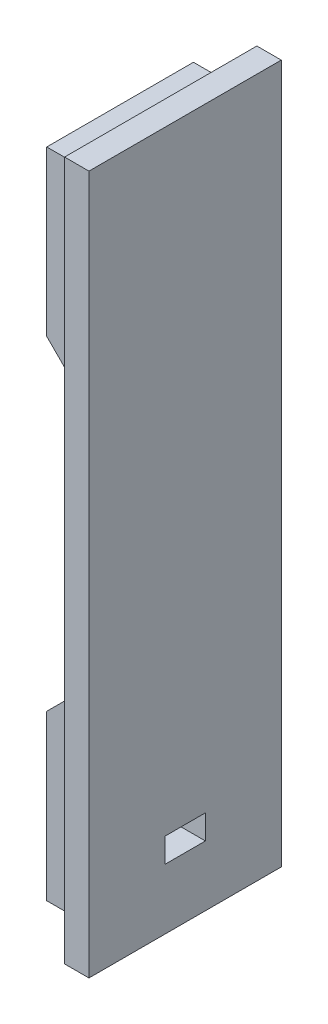
ISO-10303-21;
HEADER;
FILE_DESCRIPTION(('STEP AP214'),'2;1');
FILE_NAME('part.step','',(''),(''),'','','');
FILE_SCHEMA(('AUTOMOTIVE_DESIGN { 1 0 10303 214 1 1 1 1 }'));
ENDSEC;
DATA;
#1=APPLICATION_CONTEXT('core data for automotive mechanical design processes');
#2=APPLICATION_PROTOCOL_DEFINITION('international standard','automotive_design',2000,#1);
#3=PRODUCT_CONTEXT('',#1,'mechanical');
#4=PRODUCT('Part','Part','',(#3));
#5=PRODUCT_RELATED_PRODUCT_CATEGORY('part','',(#4));
#6=PRODUCT_DEFINITION_FORMATION('','',#4);
#7=PRODUCT_DEFINITION_CONTEXT('part definition',#1,'design');
#8=PRODUCT_DEFINITION('design','',#6,#7);
#9=PRODUCT_DEFINITION_SHAPE('','',#8);
#10=(LENGTH_UNIT() NAMED_UNIT(*) SI_UNIT(.MILLI.,.METRE.));
#11=(NAMED_UNIT(*) PLANE_ANGLE_UNIT() SI_UNIT($,.RADIAN.));
#12=(NAMED_UNIT(*) SI_UNIT($,.STERADIAN.) SOLID_ANGLE_UNIT());
#13=UNCERTAINTY_MEASURE_WITH_UNIT(LENGTH_MEASURE(1.E-05),#10,'distance_accuracy_value','');
#14=(GEOMETRIC_REPRESENTATION_CONTEXT(3) GLOBAL_UNCERTAINTY_ASSIGNED_CONTEXT((#13)) GLOBAL_UNIT_ASSIGNED_CONTEXT((#10,
#11,#12)) REPRESENTATION_CONTEXT('',''));
#15=CARTESIAN_POINT('',(0.,0.,0.));
#16=DIRECTION('',(0.,0.,1.));
#17=DIRECTION('',(1.,0.,0.));
#18=AXIS2_PLACEMENT_3D('',#15,#16,#17);
#19=CARTESIAN_POINT('',(-1.81121984232219,-0.482424220250856,-1.));
#20=DIRECTION('',(0.,0.,1.));
#21=DIRECTION('',(1.,0.,0.));
#22=AXIS2_PLACEMENT_3D('',#19,#20,#21);
#23=CYLINDRICAL_SURFACE('',#22,2.5314573644934);
#24=CARTESIAN_POINT('',(-1.81121984232219,-0.482424220250856,-1.));
#25=DIRECTION('',(0.,0.,-1.));
#26=DIRECTION('',(-1.,0.,0.));
#27=AXIS2_PLACEMENT_3D('',#24,#25,#26);
#28=CIRCLE('',#27,2.5314573644934);
#29=CARTESIAN_POINT('',(0.,-2.25097138417559,-1.));
#30=VERTEX_POINT('',#29);
#31=CARTESIAN_POINT('',(-4.03853856337355,-1.68547355552435,-1.));
#32=VERTEX_POINT('',#31);
#33=EDGE_CURVE('E330',#30,#32,#28,.T.);
#34=ORIENTED_EDGE('',*,*,#33,.T.);
#35=DIRECTION('',(0.,0.,-1.));
#36=VECTOR('',#35,1.);
#37=CARTESIAN_POINT('',(-4.03853856337355,-1.68547355552435,1.));
#38=LINE('',#37,#36);
#39=CARTESIAN_POINT('',(-4.03853856337355,-1.68547355552435,1.));
#40=VERTEX_POINT('',#39);
#41=EDGE_CURVE('E549',#40,#32,#38,.T.);
#42=ORIENTED_EDGE('',*,*,#41,.F.);
#43=CARTESIAN_POINT('',(-1.81121984232219,-0.482424220250856,1.));
#44=DIRECTION('',(0.,0.,-1.));
#45=DIRECTION('',(-1.,0.,0.));
#46=AXIS2_PLACEMENT_3D('',#43,#44,#45);
#47=CIRCLE('',#46,2.5314573644934);
#48=CARTESIAN_POINT('',(0.,-2.25097138417559,1.));
#49=VERTEX_POINT('',#48);
#50=EDGE_CURVE('E331',#49,#40,#47,.T.);
#51=ORIENTED_EDGE('',*,*,#50,.F.);
#52=DIRECTION('',(0.,0.,1.));
#53=VECTOR('',#52,1.);
#54=CARTESIAN_POINT('',(0.,-2.25097138417559,-1.));
#55=LINE('',#54,#53);
#56=EDGE_CURVE('E527',#30,#49,#55,.T.);
#57=ORIENTED_EDGE('',*,*,#56,.F.);
#58=EDGE_LOOP('',(#34,#42,#51,#57));
#59=FACE_BOUND('',#58,.T.);
#60=ADVANCED_FACE('F73',(#59),#23,.F.);
#61=CARTESIAN_POINT('',(-1.72556533612713,-0.222878793185611,-1.));
#62=DIRECTION('',(0.,0.,-1.));
#63=DIRECTION('',(-1.,0.,0.));
#64=AXIS2_PLACEMENT_3D('',#61,#62,#63);
#65=PLANE('',#64);
#66=CARTESIAN_POINT('',(-1.72556533612713,-0.222878793185611,-1.));
#67=DIRECTION('',(0.,0.,1.));
#68=DIRECTION('',(-1.,0.,0.));
#69=AXIS2_PLACEMENT_3D('',#66,#67,#68);
#70=CIRCLE('',#69,4.50000000000001);
#71=CARTESIAN_POINT('',(-5.04790859843512,-3.25801227417071,-1.));
#72=VERTEX_POINT('',#71);
#73=CARTESIAN_POINT('',(-0.193000000200739,-4.45386490650682,-1.));
#74=VERTEX_POINT('',#73);
#75=EDGE_CURVE('E327',#72,#74,#70,.T.);
#76=ORIENTED_EDGE('',*,*,#75,.F.);
#77=DIRECTION('',(0.540171392342497,0.841555029035397,0.));
#78=VECTOR('',#77,1.);
#79=CARTESIAN_POINT('',(-2.09396382164015,1.34405869375727,-1.));
#80=LINE('',#79,#78);
#81=EDGE_CURVE('E995',#72,#32,#80,.T.);
#82=ORIENTED_EDGE('',*,*,#81,.T.);
#83=ORIENTED_EDGE('',*,*,#33,.F.);
#84=DIRECTION('',(0.,1.,0.));
#85=VECTOR('',#84,1.);
#86=CARTESIAN_POINT('',(0.,0.,-1.));
#87=LINE('',#86,#85);
#88=CARTESIAN_POINT('',(0.,-4.37631595290785,-1.));
#89=VERTEX_POINT('',#88);
#90=EDGE_CURVE('E529',#89,#30,#87,.T.);
#91=ORIENTED_EDGE('',*,*,#90,.F.);
#92=DIRECTION('',(0.927897052859609,0.372836504777163,0.));
#93=VECTOR('',#92,1.);
#94=CARTESIAN_POINT('',(1.51400354520055,-3.76797714175073,-1.));
#95=LINE('',#94,#93);
#96=EDGE_CURVE('E542',#74,#89,#95,.T.);
#97=ORIENTED_EDGE('',*,*,#96,.F.);
#98=EDGE_LOOP('',(#76,#82,#83,#91,#97));
#99=FACE_BOUND('',#98,.T.);
#100=ADVANCED_FACE('F571',(#99),#65,.T.);
#101=CARTESIAN_POINT('',(-1.72556533612713,-0.222878793185611,1.));
#102=DIRECTION('',(0.,0.,-1.));
#103=DIRECTION('',(-1.,0.,0.));
#104=AXIS2_PLACEMENT_3D('',#101,#102,#103);
#105=PLANE('',#104);
#106=DIRECTION('',(0.540171392342497,0.841555029035397,0.));
#107=VECTOR('',#106,1.);
#108=CARTESIAN_POINT('',(-2.09396382164015,1.34405869375727,1.));
#109=LINE('',#108,#107);
#110=CARTESIAN_POINT('',(-5.04790859843512,-3.25801227417072,1.));
#111=VERTEX_POINT('',#110);
#112=EDGE_CURVE('E990',#111,#40,#109,.T.);
#113=ORIENTED_EDGE('',*,*,#112,.F.);
#114=CARTESIAN_POINT('',(-1.72556533612713,-0.222878793185611,1.));
#115=DIRECTION('',(0.,0.,1.));
#116=DIRECTION('',(-1.,0.,0.));
#117=AXIS2_PLACEMENT_3D('',#114,#115,#116);
#118=CIRCLE('',#117,4.50000000000001);
#119=CARTESIAN_POINT('',(-0.193000000200741,-4.45386490650682,1.));
#120=VERTEX_POINT('',#119);
#121=EDGE_CURVE('E324',#111,#120,#118,.T.);
#122=ORIENTED_EDGE('',*,*,#121,.T.);
#123=DIRECTION('',(0.927897052859609,0.372836504777163,0.));
#124=VECTOR('',#123,1.);
#125=CARTESIAN_POINT('',(1.51400354520055,-3.76797714175073,1.));
#126=LINE('',#125,#124);
#127=CARTESIAN_POINT('',(0.,-4.37631595290785,1.));
#128=VERTEX_POINT('',#127);
#129=EDGE_CURVE('E538',#120,#128,#126,.T.);
#130=ORIENTED_EDGE('',*,*,#129,.T.);
#131=DIRECTION('',(0.,1.,0.));
#132=VECTOR('',#131,1.);
#133=CARTESIAN_POINT('',(0.,0.,1.));
#134=LINE('',#133,#132);
#135=EDGE_CURVE('E524',#128,#49,#134,.T.);
#136=ORIENTED_EDGE('',*,*,#135,.T.);
#137=ORIENTED_EDGE('',*,*,#50,.T.);
#138=EDGE_LOOP('',(#113,#122,#130,#136,#137));
#139=FACE_BOUND('',#138,.T.);
#140=ADVANCED_FACE('F577',(#139),#105,.F.);
#141=CARTESIAN_POINT('',(0.,0.,0.));
#142=DIRECTION('',(1.,0.,0.));
#143=DIRECTION('',(0.,0.,-1.));
#144=AXIS2_PLACEMENT_3D('',#141,#142,#143);
#145=PLANE('',#144);
#146=DIRECTION('',(0.,-1.,0.));
#147=VECTOR('',#146,1.);
#148=CARTESIAN_POINT('',(0.,0.,1.));
#149=LINE('',#148,#147);
#150=CARTESIAN_POINT('',(0.,4.40408398069441,1.));
#151=VERTEX_POINT('',#150);
#152=CARTESIAN_POINT('',(0.,2.25097138417559,1.));
#153=VERTEX_POINT('',#152);
#154=EDGE_CURVE('E88',#151,#153,#149,.T.);
#155=ORIENTED_EDGE('',*,*,#154,.T.);
#156=DIRECTION('',(0.,0.,1.));
#157=VECTOR('',#156,1.);
#158=CARTESIAN_POINT('',(0.,2.25097138417559,-1.));
#159=LINE('',#158,#157);
#160=CARTESIAN_POINT('',(0.,2.25097138417559,-1.));
#161=VERTEX_POINT('',#160);
#162=EDGE_CURVE('E81',#153,#161,#159,.F.);
#163=ORIENTED_EDGE('',*,*,#162,.T.);
#164=DIRECTION('',(0.,-1.,0.));
#165=VECTOR('',#164,1.);
#166=CARTESIAN_POINT('',(0.,0.,-1.));
#167=LINE('',#166,#165);
#168=CARTESIAN_POINT('',(0.,4.40408398069441,-1.));
#169=VERTEX_POINT('',#168);
#170=EDGE_CURVE('E12',#169,#161,#167,.T.);
#171=ORIENTED_EDGE('',*,*,#170,.F.);
#172=DIRECTION('',(0.,0.,1.));
#173=VECTOR('',#172,1.);
#174=CARTESIAN_POINT('',(0.,4.40408398069441,0.));
#175=LINE('',#174,#173);
#176=EDGE_CURVE('E533',#169,#151,#175,.T.);
#177=ORIENTED_EDGE('',*,*,#176,.T.);
#178=EDGE_LOOP('',(#155,#163,#171,#177));
#179=FACE_BOUND('',#178,.T.);
#180=ORIENTED_EDGE('',*,*,#56,.T.);
#181=ORIENTED_EDGE('',*,*,#135,.F.);
#182=DIRECTION('',(0.,0.,1.));
#183=VECTOR('',#182,1.);
#184=CARTESIAN_POINT('',(0.,-4.37631595290785,0.));
#185=LINE('',#184,#183);
#186=EDGE_CURVE('E317',#89,#128,#185,.T.);
#187=ORIENTED_EDGE('',*,*,#186,.F.);
#188=ORIENTED_EDGE('',*,*,#90,.T.);
#189=EDGE_LOOP('',(#180,#181,#187,#188));
#190=FACE_BOUND('',#189,.T.);
#191=DIRECTION('',(0.,1.,0.));
#192=VECTOR('',#191,1.);
#193=CARTESIAN_POINT('',(0.,-38.0042229479214,5.95790668542234));
#194=LINE('',#193,#192);
#195=CARTESIAN_POINT('',(0.,-38.0042229479214,5.95790668542234));
#196=VERTEX_POINT('',#195);
#197=CARTESIAN_POINT('',(0.,38.0042229479214,5.95790668542234));
#198=VERTEX_POINT('',#197);
#199=EDGE_CURVE('E386',#196,#198,#194,.T.);
#200=ORIENTED_EDGE('',*,*,#199,.T.);
#201=DIRECTION('',(0.,0.,-1.));
#202=VECTOR('',#201,1.);
#203=CARTESIAN_POINT('',(0.,38.0042229479214,-5.95790668542234));
#204=LINE('',#203,#202);
#205=CARTESIAN_POINT('',(0.,38.0042229479214,-5.95790668542234));
#206=VERTEX_POINT('',#205);
#207=EDGE_CURVE('E389',#198,#206,#204,.T.);
#208=ORIENTED_EDGE('',*,*,#207,.T.);
#209=DIRECTION('',(0.,-1.,0.));
#210=VECTOR('',#209,1.);
#211=CARTESIAN_POINT('',(0.,-38.0042229479214,-5.95790668542234));
#212=LINE('',#211,#210);
#213=CARTESIAN_POINT('',(0.,-38.0042229479214,-5.95790668542234));
#214=VERTEX_POINT('',#213);
#215=EDGE_CURVE('E393',#206,#214,#212,.T.);
#216=ORIENTED_EDGE('',*,*,#215,.T.);
#217=DIRECTION('',(0.,0.,1.));
#218=VECTOR('',#217,1.);
#219=CARTESIAN_POINT('',(0.,-38.0042229479214,-5.95790668542234));
#220=LINE('',#219,#218);
#221=EDGE_CURVE('E396',#214,#196,#220,.T.);
#222=ORIENTED_EDGE('',*,*,#221,.T.);
#223=EDGE_LOOP('',(#200,#208,#216,#222));
#224=FACE_BOUND('',#223,.T.);
#225=DIRECTION('',(0.,0.,-1.));
#226=VECTOR('',#225,1.);
#227=CARTESIAN_POINT('',(0.,-35.5609626465849,2.5));
#228=LINE('',#227,#226);
#229=CARTESIAN_POINT('',(0.,-35.5609626465849,2.5));
#230=VERTEX_POINT('',#229);
#231=CARTESIAN_POINT('',(0.,-35.5609626465849,-2.5));
#232=VERTEX_POINT('',#231);
#233=EDGE_CURVE('E465',#230,#232,#228,.T.);
#234=ORIENTED_EDGE('',*,*,#233,.T.);
#235=DIRECTION('',(0.,1.,0.));
#236=VECTOR('',#235,1.);
#237=CARTESIAN_POINT('',(0.,-35.5609626465849,-2.5));
#238=LINE('',#237,#236);
#239=CARTESIAN_POINT('',(0.,-32.5609626465849,-2.5));
#240=VERTEX_POINT('',#239);
#241=EDGE_CURVE('E458',#232,#240,#238,.T.);
#242=ORIENTED_EDGE('',*,*,#241,.T.);
#243=DIRECTION('',(0.,0.,1.));
#244=VECTOR('',#243,1.);
#245=CARTESIAN_POINT('',(0.,-32.5609626465849,2.5));
#246=LINE('',#245,#244);
#247=CARTESIAN_POINT('',(0.,-32.5609626465849,2.5));
#248=VERTEX_POINT('',#247);
#249=EDGE_CURVE('E460',#240,#248,#246,.T.);
#250=ORIENTED_EDGE('',*,*,#249,.T.);
#251=DIRECTION('',(0.,-1.,0.));
#252=VECTOR('',#251,1.);
#253=CARTESIAN_POINT('',(0.,-35.5609626465849,2.5));
#254=LINE('',#253,#252);
#255=EDGE_CURVE('E463',#248,#230,#254,.T.);
#256=ORIENTED_EDGE('',*,*,#255,.T.);
#257=EDGE_LOOP('',(#234,#242,#250,#256));
#258=FACE_BOUND('',#257,.T.);
#259=ADVANCED_FACE('F531',(#179,#190,#224,#258),#145,.F.);
#260=CARTESIAN_POINT('',(-5.,0.,0.));
#261=DIRECTION('',(1.,0.,0.));
#262=DIRECTION('',(0.,0.,-1.));
#263=AXIS2_PLACEMENT_3D('',#260,#261,#262);
#264=PLANE('',#263);
#265=DIRECTION('',(0.,1.,0.));
#266=VECTOR('',#265,1.);
#267=CARTESIAN_POINT('',(-5.,-40.1707344698931,9.027131341549));
#268=LINE('',#267,#266);
#269=CARTESIAN_POINT('',(-5.,-40.1707344698931,9.027131341549));
#270=VERTEX_POINT('',#269);
#271=CARTESIAN_POINT('',(-5.,-19.9742079634451,9.027131341549));
#272=VERTEX_POINT('',#271);
#273=EDGE_CURVE('E422',#270,#272,#268,.T.);
#274=ORIENTED_EDGE('',*,*,#273,.T.);
#275=DIRECTION('',(0.,0.,1.));
#276=VECTOR('',#275,1.);
#277=CARTESIAN_POINT('',(-5.,-19.9742079634451,-11.8333333333333));
#278=LINE('',#277,#276);
#279=CARTESIAN_POINT('',(-5.,-19.9742079634451,5.95790668542234));
#280=VERTEX_POINT('',#279);
#281=EDGE_CURVE('E349',#280,#272,#278,.T.);
#282=ORIENTED_EDGE('',*,*,#281,.F.);
#283=DIRECTION('',(0.,1.,0.));
#284=VECTOR('',#283,1.);
#285=CARTESIAN_POINT('',(-5.,-38.0042229479214,5.95790668542234));
#286=LINE('',#285,#284);
#287=CARTESIAN_POINT('',(-5.,-38.0042229479214,5.95790668542234));
#288=VERTEX_POINT('',#287);
#289=EDGE_CURVE('E400',#288,#280,#286,.T.);
#290=ORIENTED_EDGE('',*,*,#289,.F.);
#291=DIRECTION('',(0.,0.,1.));
#292=VECTOR('',#291,1.);
#293=CARTESIAN_POINT('',(-5.,-38.0042229479214,-5.95790668542234));
#294=LINE('',#293,#292);
#295=CARTESIAN_POINT('',(-5.,-38.0042229479214,-5.95790668542234));
#296=VERTEX_POINT('',#295);
#297=EDGE_CURVE('E390',#296,#288,#294,.T.);
#298=ORIENTED_EDGE('',*,*,#297,.F.);
#299=DIRECTION('',(0.,-1.,0.));
#300=VECTOR('',#299,1.);
#301=CARTESIAN_POINT('',(-5.,-38.0042229479214,-5.95790668542234));
#302=LINE('',#301,#300);
#303=CARTESIAN_POINT('',(-5.,-19.9742079634451,-5.95790668542234));
#304=VERTEX_POINT('',#303);
#305=EDGE_CURVE('E406',#304,#296,#302,.T.);
#306=ORIENTED_EDGE('',*,*,#305,.F.);
#307=CARTESIAN_POINT('',(-5.,-19.9742079634451,-9.027131341549));
#308=VERTEX_POINT('',#307);
#309=EDGE_CURVE('E348',#308,#304,#278,.T.);
#310=ORIENTED_EDGE('',*,*,#309,.F.);
#311=DIRECTION('',(0.,-1.,0.));
#312=VECTOR('',#311,1.);
#313=CARTESIAN_POINT('',(-5.,-40.1707344698931,-9.027131341549));
#314=LINE('',#313,#312);
#315=CARTESIAN_POINT('',(-5.,-40.1707344698931,-9.027131341549));
#316=VERTEX_POINT('',#315);
#317=EDGE_CURVE('E428',#308,#316,#314,.T.);
#318=ORIENTED_EDGE('',*,*,#317,.T.);
#319=DIRECTION('',(0.,0.,1.));
#320=VECTOR('',#319,1.);
#321=CARTESIAN_POINT('',(-5.,-40.1707344698931,-9.027131341549));
#322=LINE('',#321,#320);
#323=EDGE_CURVE('E432',#316,#270,#322,.T.);
#324=ORIENTED_EDGE('',*,*,#323,.T.);
#325=EDGE_LOOP('',(#274,#282,#290,#298,#306,#310,#318,#324));
#326=FACE_BOUND('',#325,.T.);
#327=ADVANCED_FACE('F603',(#326),#264,.F.);
#328=CARTESIAN_POINT('',(3.,-43.,-11.8333333333333));
#329=DIRECTION('',(0.,0.,1.));
#330=DIRECTION('',(1.,0.,0.));
#331=AXIS2_PLACEMENT_3D('',#328,#329,#330);
#332=PLANE('',#331);
#333=DIRECTION('',(0.,1.,0.));
#334=VECTOR('',#333,1.);
#335=CARTESIAN_POINT('',(0.,-43.,-11.8333333333333));
#336=LINE('',#335,#334);
#337=CARTESIAN_POINT('',(0.,-43.,-11.8333333333333));
#338=VERTEX_POINT('',#337);
#339=CARTESIAN_POINT('',(0.,43.,-11.8333333333333));
#340=VERTEX_POINT('',#339);
#341=EDGE_CURVE('E479',#338,#340,#336,.T.);
#342=ORIENTED_EDGE('',*,*,#341,.T.);
#343=DIRECTION('',(-1.,0.,0.));
#344=VECTOR('',#343,1.);
#345=CARTESIAN_POINT('',(3.,43.,-11.8333333333333));
#346=LINE('',#345,#344);
#347=CARTESIAN_POINT('',(3.,43.,-11.8333333333333));
#348=VERTEX_POINT('',#347);
#349=EDGE_CURVE('E512',#348,#340,#346,.T.);
#350=ORIENTED_EDGE('',*,*,#349,.F.);
#351=DIRECTION('',(0.,1.,0.));
#352=VECTOR('',#351,1.);
#353=CARTESIAN_POINT('',(3.,-43.,-11.8333333333333));
#354=LINE('',#353,#352);
#355=CARTESIAN_POINT('',(3.,-43.,-11.8333333333333));
#356=VERTEX_POINT('',#355);
#357=EDGE_CURVE('E486',#356,#348,#354,.T.);
#358=ORIENTED_EDGE('',*,*,#357,.F.);
#359=DIRECTION('',(-1.,0.,0.));
#360=VECTOR('',#359,1.);
#361=CARTESIAN_POINT('',(3.,-43.,-11.8333333333333));
#362=LINE('',#361,#360);
#363=EDGE_CURVE('E496',#356,#338,#362,.T.);
#364=ORIENTED_EDGE('',*,*,#363,.T.);
#365=EDGE_LOOP('',(#342,#350,#358,#364));
#366=FACE_BOUND('',#365,.T.);
#367=ADVANCED_FACE('F75',(#366),#332,.F.);
#368=CARTESIAN_POINT('',(3.,43.,11.8333333333333));
#369=DIRECTION('',(0.,-1.,0.));
#370=DIRECTION('',(0.,0.,-1.));
#371=AXIS2_PLACEMENT_3D('',#368,#369,#370);
#372=PLANE('',#371);
#373=DIRECTION('',(0.,0.,1.));
#374=VECTOR('',#373,1.);
#375=CARTESIAN_POINT('',(0.,43.,11.8333333333333));
#376=LINE('',#375,#374);
#377=CARTESIAN_POINT('',(0.,43.,11.8333333333333));
#378=VERTEX_POINT('',#377);
#379=EDGE_CURVE('E499',#340,#378,#376,.T.);
#380=ORIENTED_EDGE('',*,*,#379,.T.);
#381=DIRECTION('',(-1.,0.,0.));
#382=VECTOR('',#381,1.);
#383=CARTESIAN_POINT('',(3.,43.,11.8333333333333));
#384=LINE('',#383,#382);
#385=CARTESIAN_POINT('',(3.,43.,11.8333333333333));
#386=VERTEX_POINT('',#385);
#387=EDGE_CURVE('E509',#386,#378,#384,.T.);
#388=ORIENTED_EDGE('',*,*,#387,.F.);
#389=DIRECTION('',(0.,0.,1.));
#390=VECTOR('',#389,1.);
#391=CARTESIAN_POINT('',(3.,43.,11.8333333333333));
#392=LINE('',#391,#390);
#393=EDGE_CURVE('E489',#348,#386,#392,.T.);
#394=ORIENTED_EDGE('',*,*,#393,.F.);
#395=ORIENTED_EDGE('',*,*,#349,.T.);
#396=EDGE_LOOP('',(#380,#388,#394,#395));
#397=FACE_BOUND('',#396,.T.);
#398=ADVANCED_FACE('F669',(#397),#372,.F.);
#399=CARTESIAN_POINT('',(3.,-43.,11.8333333333333));
#400=DIRECTION('',(0.,0.,-1.));
#401=DIRECTION('',(-1.,0.,0.));
#402=AXIS2_PLACEMENT_3D('',#399,#400,#401);
#403=PLANE('',#402);
#404=DIRECTION('',(0.,-1.,0.));
#405=VECTOR('',#404,1.);
#406=CARTESIAN_POINT('',(0.,-43.,11.8333333333333));
#407=LINE('',#406,#405);
#408=CARTESIAN_POINT('',(0.,-43.,11.8333333333333));
#409=VERTEX_POINT('',#408);
#410=EDGE_CURVE('E501',#378,#409,#407,.T.);
#411=ORIENTED_EDGE('',*,*,#410,.T.);
#412=DIRECTION('',(-1.,0.,0.));
#413=VECTOR('',#412,1.);
#414=CARTESIAN_POINT('',(3.,-43.,11.8333333333333));
#415=LINE('',#414,#413);
#416=CARTESIAN_POINT('',(3.,-43.,11.8333333333333));
#417=VERTEX_POINT('',#416);
#418=EDGE_CURVE('E506',#417,#409,#415,.T.);
#419=ORIENTED_EDGE('',*,*,#418,.F.);
#420=DIRECTION('',(0.,-1.,0.));
#421=VECTOR('',#420,1.);
#422=CARTESIAN_POINT('',(3.,-43.,11.8333333333333));
#423=LINE('',#422,#421);
#424=EDGE_CURVE('E492',#386,#417,#423,.T.);
#425=ORIENTED_EDGE('',*,*,#424,.F.);
#426=ORIENTED_EDGE('',*,*,#387,.T.);
#427=EDGE_LOOP('',(#411,#419,#425,#426));
#428=FACE_BOUND('',#427,.T.);
#429=ADVANCED_FACE('F666',(#428),#403,.F.);
#430=CARTESIAN_POINT('',(3.,-43.,11.8333333333333));
#431=DIRECTION('',(0.,1.,0.));
#432=DIRECTION('',(0.,0.,1.));
#433=AXIS2_PLACEMENT_3D('',#430,#431,#432);
#434=PLANE('',#433);
#435=DIRECTION('',(0.,0.,-1.));
#436=VECTOR('',#435,1.);
#437=CARTESIAN_POINT('',(0.,-43.,11.8333333333333));
#438=LINE('',#437,#436);
#439=EDGE_CURVE('E490',#409,#338,#438,.T.);
#440=ORIENTED_EDGE('',*,*,#439,.T.);
#441=ORIENTED_EDGE('',*,*,#363,.F.);
#442=DIRECTION('',(0.,0.,-1.));
#443=VECTOR('',#442,1.);
#444=CARTESIAN_POINT('',(3.,-43.,11.8333333333333));
#445=LINE('',#444,#443);
#446=EDGE_CURVE('E494',#417,#356,#445,.T.);
#447=ORIENTED_EDGE('',*,*,#446,.F.);
#448=ORIENTED_EDGE('',*,*,#418,.T.);
#449=EDGE_LOOP('',(#440,#441,#447,#448));
#450=FACE_BOUND('',#449,.T.);
#451=ADVANCED_FACE('F659',(#450),#434,.F.);
#452=CARTESIAN_POINT('',(3.,0.,0.));
#453=DIRECTION('',(-1.,0.,0.));
#454=DIRECTION('',(0.,0.,1.));
#455=AXIS2_PLACEMENT_3D('',#452,#453,#454);
#456=PLANE('',#455);
#457=DIRECTION('',(0.,0.,1.));
#458=VECTOR('',#457,1.);
#459=CARTESIAN_POINT('',(3.,-32.5609626465849,2.5));
#460=LINE('',#459,#458);
#461=CARTESIAN_POINT('',(3.,-32.5609626465849,-2.5));
#462=VERTEX_POINT('',#461);
#463=CARTESIAN_POINT('',(3.,-32.5609626465849,2.5));
#464=VERTEX_POINT('',#463);
#465=EDGE_CURVE('E469',#462,#464,#460,.T.);
#466=ORIENTED_EDGE('',*,*,#465,.F.);
#467=DIRECTION('',(0.,1.,0.));
#468=VECTOR('',#467,1.);
#469=CARTESIAN_POINT('',(3.,-35.5609626465849,-2.5));
#470=LINE('',#469,#468);
#471=CARTESIAN_POINT('',(3.,-35.5609626465849,-2.5));
#472=VERTEX_POINT('',#471);
#473=EDGE_CURVE('E457',#472,#462,#470,.T.);
#474=ORIENTED_EDGE('',*,*,#473,.F.);
#475=DIRECTION('',(0.,0.,-1.));
#476=VECTOR('',#475,1.);
#477=CARTESIAN_POINT('',(3.,-35.5609626465849,2.5));
#478=LINE('',#477,#476);
#479=CARTESIAN_POINT('',(3.,-35.5609626465849,2.5));
#480=VERTEX_POINT('',#479);
#481=EDGE_CURVE('E461',#480,#472,#478,.T.);
#482=ORIENTED_EDGE('',*,*,#481,.F.);
#483=DIRECTION('',(0.,-1.,0.));
#484=VECTOR('',#483,1.);
#485=CARTESIAN_POINT('',(3.,-35.5609626465849,2.5));
#486=LINE('',#485,#484);
#487=EDGE_CURVE('E472',#464,#480,#486,.T.);
#488=ORIENTED_EDGE('',*,*,#487,.F.);
#489=EDGE_LOOP('',(#466,#474,#482,#488));
#490=FACE_BOUND('',#489,.T.);
#491=ORIENTED_EDGE('',*,*,#357,.T.);
#492=ORIENTED_EDGE('',*,*,#393,.T.);
#493=ORIENTED_EDGE('',*,*,#424,.T.);
#494=ORIENTED_EDGE('',*,*,#446,.T.);
#495=EDGE_LOOP('',(#491,#492,#493,#494));
#496=FACE_BOUND('',#495,.T.);
#497=ADVANCED_FACE('F656',(#490,#496),#456,.F.);
#498=CARTESIAN_POINT('',(0.,0.,0.));
#499=DIRECTION('',(-1.,0.,0.));
#500=DIRECTION('',(0.,0.,1.));
#501=AXIS2_PLACEMENT_3D('',#498,#499,#500);
#502=PLANE('',#501);
#503=DIRECTION('',(0.,1.,0.));
#504=VECTOR('',#503,1.);
#505=CARTESIAN_POINT('',(0.,-40.1707344698931,9.027131341549));
#506=LINE('',#505,#504);
#507=CARTESIAN_POINT('',(0.,-40.1707344698931,9.027131341549));
#508=VERTEX_POINT('',#507);
#509=CARTESIAN_POINT('',(0.,40.1707344698931,9.027131341549));
#510=VERTEX_POINT('',#509);
#511=EDGE_CURVE('E414',#508,#510,#506,.T.);
#512=ORIENTED_EDGE('',*,*,#511,.F.);
#513=DIRECTION('',(0.,0.,1.));
#514=VECTOR('',#513,1.);
#515=CARTESIAN_POINT('',(0.,-40.1707344698931,-9.027131341549));
#516=LINE('',#515,#514);
#517=CARTESIAN_POINT('',(0.,-40.1707344698931,-9.027131341549));
#518=VERTEX_POINT('',#517);
#519=EDGE_CURVE('E443',#518,#508,#516,.T.);
#520=ORIENTED_EDGE('',*,*,#519,.F.);
#521=DIRECTION('',(0.,-1.,0.));
#522=VECTOR('',#521,1.);
#523=CARTESIAN_POINT('',(0.,-40.1707344698931,-9.027131341549));
#524=LINE('',#523,#522);
#525=CARTESIAN_POINT('',(0.,40.1707344698931,-9.027131341549));
#526=VERTEX_POINT('',#525);
#527=EDGE_CURVE('E440',#526,#518,#524,.T.);
#528=ORIENTED_EDGE('',*,*,#527,.F.);
#529=DIRECTION('',(0.,0.,-1.));
#530=VECTOR('',#529,1.);
#531=CARTESIAN_POINT('',(0.,40.1707344698931,-9.027131341549));
#532=LINE('',#531,#530);
#533=EDGE_CURVE('E437',#510,#526,#532,.T.);
#534=ORIENTED_EDGE('',*,*,#533,.F.);
#535=EDGE_LOOP('',(#512,#520,#528,#534));
#536=FACE_BOUND('',#535,.T.);
#537=ORIENTED_EDGE('',*,*,#341,.F.);
#538=ORIENTED_EDGE('',*,*,#439,.F.);
#539=ORIENTED_EDGE('',*,*,#410,.F.);
#540=ORIENTED_EDGE('',*,*,#379,.F.);
#541=EDGE_LOOP('',(#537,#538,#539,#540));
#542=FACE_BOUND('',#541,.T.);
#543=ADVANCED_FACE('F654',(#536,#542),#502,.T.);
#544=CARTESIAN_POINT('',(0.,-35.5609626465849,-2.5));
#545=DIRECTION('',(0.,0.,-1.));
#546=DIRECTION('',(-1.,0.,0.));
#547=AXIS2_PLACEMENT_3D('',#544,#545,#546);
#548=PLANE('',#547);
#549=ORIENTED_EDGE('',*,*,#473,.T.);
#550=DIRECTION('',(1.,0.,0.));
#551=VECTOR('',#550,1.);
#552=CARTESIAN_POINT('',(0.,-32.5609626465849,-2.5));
#553=LINE('',#552,#551);
#554=EDGE_CURVE('E467',#240,#462,#553,.T.);
#555=ORIENTED_EDGE('',*,*,#554,.F.);
#556=ORIENTED_EDGE('',*,*,#241,.F.);
#557=DIRECTION('',(1.,0.,0.));
#558=VECTOR('',#557,1.);
#559=CARTESIAN_POINT('',(0.,-35.5609626465849,-2.5));
#560=LINE('',#559,#558);
#561=EDGE_CURVE('E477',#232,#472,#560,.T.);
#562=ORIENTED_EDGE('',*,*,#561,.T.);
#563=EDGE_LOOP('',(#549,#555,#556,#562));
#564=FACE_BOUND('',#563,.T.);
#565=ADVANCED_FACE('F644',(#564),#548,.F.);
#566=CARTESIAN_POINT('',(0.,-35.5609626465849,2.5));
#567=DIRECTION('',(0.,-1.,0.));
#568=DIRECTION('',(0.,0.,-1.));
#569=AXIS2_PLACEMENT_3D('',#566,#567,#568);
#570=PLANE('',#569);
#571=ORIENTED_EDGE('',*,*,#481,.T.);
#572=ORIENTED_EDGE('',*,*,#561,.F.);
#573=ORIENTED_EDGE('',*,*,#233,.F.);
#574=DIRECTION('',(1.,0.,0.));
#575=VECTOR('',#574,1.);
#576=CARTESIAN_POINT('',(0.,-35.5609626465849,2.5));
#577=LINE('',#576,#575);
#578=EDGE_CURVE('E480',#230,#480,#577,.T.);
#579=ORIENTED_EDGE('',*,*,#578,.T.);
#580=EDGE_LOOP('',(#571,#572,#573,#579));
#581=FACE_BOUND('',#580,.T.);
#582=ADVANCED_FACE('F640',(#581),#570,.F.);
#583=CARTESIAN_POINT('',(0.,-35.5609626465849,2.5));
#584=DIRECTION('',(0.,0.,1.));
#585=DIRECTION('',(1.,0.,0.));
#586=AXIS2_PLACEMENT_3D('',#583,#584,#585);
#587=PLANE('',#586);
#588=ORIENTED_EDGE('',*,*,#487,.T.);
#589=ORIENTED_EDGE('',*,*,#578,.F.);
#590=ORIENTED_EDGE('',*,*,#255,.F.);
#591=DIRECTION('',(1.,0.,0.));
#592=VECTOR('',#591,1.);
#593=CARTESIAN_POINT('',(0.,-32.5609626465849,2.5));
#594=LINE('',#593,#592);
#595=EDGE_CURVE('E482',#248,#464,#594,.T.);
#596=ORIENTED_EDGE('',*,*,#595,.T.);
#597=EDGE_LOOP('',(#588,#589,#590,#596));
#598=FACE_BOUND('',#597,.T.);
#599=ADVANCED_FACE('F643',(#598),#587,.F.);
#600=CARTESIAN_POINT('',(0.,-32.5609626465849,2.5));
#601=DIRECTION('',(0.,1.,0.));
#602=DIRECTION('',(0.,0.,1.));
#603=AXIS2_PLACEMENT_3D('',#600,#601,#602);
#604=PLANE('',#603);
#605=ORIENTED_EDGE('',*,*,#465,.T.);
#606=ORIENTED_EDGE('',*,*,#595,.F.);
#607=ORIENTED_EDGE('',*,*,#249,.F.);
#608=ORIENTED_EDGE('',*,*,#554,.T.);
#609=EDGE_LOOP('',(#605,#606,#607,#608));
#610=FACE_BOUND('',#609,.T.);
#611=ADVANCED_FACE('F624',(#610),#604,.F.);
#612=CARTESIAN_POINT('',(-5.,40.1707344698931,-9.027131341549));
#613=VERTEX_POINT('',#612);
#614=CARTESIAN_POINT('',(-5.00000000000001,19.9742079634451,-9.027131341549));
#615=VERTEX_POINT('',#614);
#616=EDGE_CURVE('E429',#613,#615,#314,.T.);
#617=ORIENTED_EDGE('',*,*,#616,.T.);
#618=DIRECTION('',(0.,0.,1.));
#619=VECTOR('',#618,1.);
#620=CARTESIAN_POINT('',(-5.00000000000001,19.9742079634451,-11.8333333333333));
#621=LINE('',#620,#619);
#622=CARTESIAN_POINT('',(-5.00000000000001,19.9742079634451,-5.95790668542234));
#623=VERTEX_POINT('',#622);
#624=EDGE_CURVE('E351',#615,#623,#621,.T.);
#625=ORIENTED_EDGE('',*,*,#624,.T.);
#626=CARTESIAN_POINT('',(-5.,38.0042229479214,-5.95790668542234));
#627=VERTEX_POINT('',#626);
#628=EDGE_CURVE('E407',#627,#623,#302,.T.);
#629=ORIENTED_EDGE('',*,*,#628,.F.);
#630=DIRECTION('',(0.,0.,-1.));
#631=VECTOR('',#630,1.);
#632=CARTESIAN_POINT('',(-5.,38.0042229479214,-5.95790668542234));
#633=LINE('',#632,#631);
#634=CARTESIAN_POINT('',(-5.,38.0042229479214,5.95790668542234));
#635=VERTEX_POINT('',#634);
#636=EDGE_CURVE('E403',#635,#627,#633,.T.);
#637=ORIENTED_EDGE('',*,*,#636,.F.);
#638=CARTESIAN_POINT('',(-5.,19.9742079634451,5.95790668542234));
#639=VERTEX_POINT('',#638);
#640=EDGE_CURVE('E385',#639,#635,#286,.T.);
#641=ORIENTED_EDGE('',*,*,#640,.F.);
#642=CARTESIAN_POINT('',(-5.00000000000001,19.9742079634451,9.027131341549));
#643=VERTEX_POINT('',#642);
#644=EDGE_CURVE('E352',#639,#643,#621,.T.);
#645=ORIENTED_EDGE('',*,*,#644,.T.);
#646=CARTESIAN_POINT('',(-5.,40.1707344698931,9.027131341549));
#647=VERTEX_POINT('',#646);
#648=EDGE_CURVE('E426',#643,#647,#268,.T.);
#649=ORIENTED_EDGE('',*,*,#648,.T.);
#650=DIRECTION('',(0.,0.,-1.));
#651=VECTOR('',#650,1.);
#652=CARTESIAN_POINT('',(-5.,40.1707344698931,-9.027131341549));
#653=LINE('',#652,#651);
#654=EDGE_CURVE('E425',#647,#613,#653,.T.);
#655=ORIENTED_EDGE('',*,*,#654,.T.);
#656=EDGE_LOOP('',(#617,#625,#629,#637,#641,#645,#649,#655));
#657=FACE_BOUND('',#656,.T.);
#658=ADVANCED_FACE('F620',(#657),#264,.F.);
#659=CARTESIAN_POINT('',(-5.,-40.1707344698931,-9.027131341549));
#660=DIRECTION('',(0.,1.,0.));
#661=DIRECTION('',(0.,0.,1.));
#662=AXIS2_PLACEMENT_3D('',#659,#660,#661);
#663=PLANE('',#662);
#664=ORIENTED_EDGE('',*,*,#519,.T.);
#665=DIRECTION('',(1.,0.,0.));
#666=VECTOR('',#665,1.);
#667=CARTESIAN_POINT('',(-5.,-40.1707344698931,9.027131341549));
#668=LINE('',#667,#666);
#669=EDGE_CURVE('E434',#270,#508,#668,.T.);
#670=ORIENTED_EDGE('',*,*,#669,.F.);
#671=ORIENTED_EDGE('',*,*,#323,.F.);
#672=DIRECTION('',(1.,0.,0.));
#673=VECTOR('',#672,1.);
#674=CARTESIAN_POINT('',(-5.,-40.1707344698931,-9.027131341549));
#675=LINE('',#674,#673);
#676=EDGE_CURVE('E448',#316,#518,#675,.T.);
#677=ORIENTED_EDGE('',*,*,#676,.T.);
#678=EDGE_LOOP('',(#664,#670,#671,#677));
#679=FACE_BOUND('',#678,.T.);
#680=ADVANCED_FACE('F623',(#679),#663,.F.);
#681=CARTESIAN_POINT('',(-5.,-40.1707344698931,-9.027131341549));
#682=DIRECTION('',(0.,0.,1.));
#683=DIRECTION('',(1.,0.,0.));
#684=AXIS2_PLACEMENT_3D('',#681,#682,#683);
#685=PLANE('',#684);
#686=ORIENTED_EDGE('',*,*,#317,.F.);
#687=DIRECTION('',(0.707106781186548,0.707106781186547,0.));
#688=VECTOR('',#687,1.);
#689=CARTESIAN_POINT('',(-15.098263253224,-30.0724712166691,-9.027131341549));
#690=LINE('',#689,#688);
#691=CARTESIAN_POINT('',(-1.71487445466791,-16.689082418113,-9.027131341549));
#692=VERTEX_POINT('',#691);
#693=EDGE_CURVE('E373',#308,#692,#690,.T.);
#694=ORIENTED_EDGE('',*,*,#693,.T.);
#695=DIRECTION('',(0.,1.,0.));
#696=VECTOR('',#695,1.);
#697=CARTESIAN_POINT('',(-1.71487445466792,-40.1707344698931,-9.027131341549));
#698=LINE('',#697,#696);
#699=CARTESIAN_POINT('',(-1.71487445466791,16.689082418113,-9.027131341549));
#700=VERTEX_POINT('',#699);
#701=EDGE_CURVE('E382',#692,#700,#698,.T.);
#702=ORIENTED_EDGE('',*,*,#701,.T.);
#703=DIRECTION('',(-0.707106781186544,0.707106781186551,0.));
#704=VECTOR('',#703,1.);
#705=CARTESIAN_POINT('',(25.0724712166691,-10.0982632532243,-9.027131341549));
#706=LINE('',#705,#704);
#707=EDGE_CURVE('E364',#700,#615,#706,.T.);
#708=ORIENTED_EDGE('',*,*,#707,.T.);
#709=ORIENTED_EDGE('',*,*,#616,.F.);
#710=DIRECTION('',(1.,0.,0.));
#711=VECTOR('',#710,1.);
#712=CARTESIAN_POINT('',(-5.,40.1707344698931,-9.027131341549));
#713=LINE('',#712,#711);
#714=EDGE_CURVE('E451',#613,#526,#713,.T.);
#715=ORIENTED_EDGE('',*,*,#714,.T.);
#716=ORIENTED_EDGE('',*,*,#527,.T.);
#717=ORIENTED_EDGE('',*,*,#676,.F.);
#718=EDGE_LOOP('',(#686,#694,#702,#708,#709,#715,#716,#717));
#719=FACE_BOUND('',#718,.T.);
#720=ADVANCED_FACE('F628',(#719),#685,.F.);
#721=CARTESIAN_POINT('',(-5.,40.1707344698931,-9.027131341549));
#722=DIRECTION('',(0.,-1.,0.));
#723=DIRECTION('',(0.,0.,-1.));
#724=AXIS2_PLACEMENT_3D('',#721,#722,#723);
#725=PLANE('',#724);
#726=ORIENTED_EDGE('',*,*,#533,.T.);
#727=ORIENTED_EDGE('',*,*,#714,.F.);
#728=ORIENTED_EDGE('',*,*,#654,.F.);
#729=DIRECTION('',(1.,0.,0.));
#730=VECTOR('',#729,1.);
#731=CARTESIAN_POINT('',(-5.,40.1707344698931,9.027131341549));
#732=LINE('',#731,#730);
#733=EDGE_CURVE('E454',#647,#510,#732,.T.);
#734=ORIENTED_EDGE('',*,*,#733,.T.);
#735=EDGE_LOOP('',(#726,#727,#728,#734));
#736=FACE_BOUND('',#735,.T.);
#737=ADVANCED_FACE('F632',(#736),#725,.F.);
#738=CARTESIAN_POINT('',(-5.,-40.1707344698931,9.027131341549));
#739=DIRECTION('',(0.,0.,-1.));
#740=DIRECTION('',(-1.,0.,0.));
#741=AXIS2_PLACEMENT_3D('',#738,#739,#740);
#742=PLANE('',#741);
#743=DIRECTION('',(0.,-1.,0.));
#744=VECTOR('',#743,1.);
#745=CARTESIAN_POINT('',(-1.71487445466792,-40.1707344698931,9.027131341549));
#746=LINE('',#745,#744);
#747=CARTESIAN_POINT('',(-1.71487445466791,16.689082418113,9.027131341549));
#748=VERTEX_POINT('',#747);
#749=CARTESIAN_POINT('',(-1.71487445466791,-16.689082418113,9.027131341549));
#750=VERTEX_POINT('',#749);
#751=EDGE_CURVE('E379',#748,#750,#746,.T.);
#752=ORIENTED_EDGE('',*,*,#751,.T.);
#753=DIRECTION('',(-0.707106781186548,-0.707106781186547,0.));
#754=VECTOR('',#753,1.);
#755=CARTESIAN_POINT('',(-15.098263253224,-30.0724712166691,9.027131341549));
#756=LINE('',#755,#754);
#757=EDGE_CURVE('E370',#750,#272,#756,.T.);
#758=ORIENTED_EDGE('',*,*,#757,.T.);
#759=ORIENTED_EDGE('',*,*,#273,.F.);
#760=ORIENTED_EDGE('',*,*,#669,.T.);
#761=ORIENTED_EDGE('',*,*,#511,.T.);
#762=ORIENTED_EDGE('',*,*,#733,.F.);
#763=ORIENTED_EDGE('',*,*,#648,.F.);
#764=DIRECTION('',(0.707106781186544,-0.707106781186551,0.));
#765=VECTOR('',#764,1.);
#766=CARTESIAN_POINT('',(25.0724712166691,-10.0982632532243,9.027131341549));
#767=LINE('',#766,#765);
#768=EDGE_CURVE('E361',#643,#748,#767,.T.);
#769=ORIENTED_EDGE('',*,*,#768,.T.);
#770=EDGE_LOOP('',(#752,#758,#759,#760,#761,#762,#763,#769));
#771=FACE_BOUND('',#770,.T.);
#772=ADVANCED_FACE('F618',(#771),#742,.F.);
#773=CARTESIAN_POINT('',(0.,-38.0042229479214,5.95790668542234));
#774=DIRECTION('',(0.,0.,1.));
#775=DIRECTION('',(1.,0.,0.));
#776=AXIS2_PLACEMENT_3D('',#773,#774,#775);
#777=PLANE('',#776);
#778=ORIENTED_EDGE('',*,*,#289,.T.);
#779=DIRECTION('',(0.707106781186548,0.707106781186547,0.));
#780=VECTOR('',#779,1.);
#781=CARTESIAN_POINT('',(-11.5150074922381,-26.4892154556832,5.95790668542234));
#782=LINE('',#781,#780);
#783=CARTESIAN_POINT('',(-1.71487445466791,-16.689082418113,5.95790668542234));
#784=VERTEX_POINT('',#783);
#785=EDGE_CURVE('E367',#280,#784,#782,.T.);
#786=ORIENTED_EDGE('',*,*,#785,.T.);
#787=DIRECTION('',(0.,1.,0.));
#788=VECTOR('',#787,1.);
#789=CARTESIAN_POINT('',(-1.71487445466792,-38.0042229479214,5.95790668542234));
#790=LINE('',#789,#788);
#791=CARTESIAN_POINT('',(-1.71487445466791,16.689082418113,5.95790668542234));
#792=VERTEX_POINT('',#791);
#793=EDGE_CURVE('E376',#784,#792,#790,.T.);
#794=ORIENTED_EDGE('',*,*,#793,.T.);
#795=DIRECTION('',(-0.707106781186544,0.707106781186551,0.));
#796=VECTOR('',#795,1.);
#797=CARTESIAN_POINT('',(26.4892154556832,-11.5150074922384,5.95790668542234));
#798=LINE('',#797,#796);
#799=EDGE_CURVE('E358',#792,#639,#798,.T.);
#800=ORIENTED_EDGE('',*,*,#799,.T.);
#801=ORIENTED_EDGE('',*,*,#640,.T.);
#802=DIRECTION('',(-1.,0.,0.));
#803=VECTOR('',#802,1.);
#804=CARTESIAN_POINT('',(0.,38.0042229479214,5.95790668542234));
#805=LINE('',#804,#803);
#806=EDGE_CURVE('E399',#198,#635,#805,.T.);
#807=ORIENTED_EDGE('',*,*,#806,.F.);
#808=ORIENTED_EDGE('',*,*,#199,.F.);
#809=DIRECTION('',(-1.,0.,0.));
#810=VECTOR('',#809,1.);
#811=CARTESIAN_POINT('',(0.,-38.0042229479214,5.95790668542234));
#812=LINE('',#811,#810);
#813=EDGE_CURVE('E412',#196,#288,#812,.T.);
#814=ORIENTED_EDGE('',*,*,#813,.T.);
#815=EDGE_LOOP('',(#778,#786,#794,#800,#801,#807,#808,#814));
#816=FACE_BOUND('',#815,.T.);
#817=ADVANCED_FACE('F608',(#816),#777,.F.);
#818=CARTESIAN_POINT('',(0.,-38.0042229479214,-5.95790668542234));
#819=DIRECTION('',(0.,-1.,0.));
#820=DIRECTION('',(0.,0.,-1.));
#821=AXIS2_PLACEMENT_3D('',#818,#819,#820);
#822=PLANE('',#821);
#823=ORIENTED_EDGE('',*,*,#297,.T.);
#824=ORIENTED_EDGE('',*,*,#813,.F.);
#825=ORIENTED_EDGE('',*,*,#221,.F.);
#826=DIRECTION('',(-1.,0.,0.));
#827=VECTOR('',#826,1.);
#828=CARTESIAN_POINT('',(0.,-38.0042229479214,-5.95790668542234));
#829=LINE('',#828,#827);
#830=EDGE_CURVE('E415',#214,#296,#829,.T.);
#831=ORIENTED_EDGE('',*,*,#830,.T.);
#832=EDGE_LOOP('',(#823,#824,#825,#831));
#833=FACE_BOUND('',#832,.T.);
#834=ADVANCED_FACE('F604',(#833),#822,.F.);
#835=CARTESIAN_POINT('',(0.,-38.0042229479214,-5.95790668542234));
#836=DIRECTION('',(0.,0.,-1.));
#837=DIRECTION('',(-1.,0.,0.));
#838=AXIS2_PLACEMENT_3D('',#835,#836,#837);
#839=PLANE('',#838);
#840=DIRECTION('',(0.,-1.,0.));
#841=VECTOR('',#840,1.);
#842=CARTESIAN_POINT('',(-1.71487445466792,-38.0042229479214,-5.95790668542234));
#843=LINE('',#842,#841);
#844=CARTESIAN_POINT('',(-1.71487445466791,16.6890824181129,-5.95790668542234));
#845=VERTEX_POINT('',#844);
#846=CARTESIAN_POINT('',(-1.71487445466791,-16.689082418113,-5.95790668542234));
#847=VERTEX_POINT('',#846);
#848=EDGE_CURVE('E518',#845,#847,#843,.T.);
#849=ORIENTED_EDGE('',*,*,#848,.T.);
#850=DIRECTION('',(-0.707106781186548,-0.707106781186547,0.));
#851=VECTOR('',#850,1.);
#852=CARTESIAN_POINT('',(-11.5150074922381,-26.4892154556832,-5.95790668542234));
#853=LINE('',#852,#851);
#854=EDGE_CURVE('E521',#847,#304,#853,.T.);
#855=ORIENTED_EDGE('',*,*,#854,.T.);
#856=ORIENTED_EDGE('',*,*,#305,.T.);
#857=ORIENTED_EDGE('',*,*,#830,.F.);
#858=ORIENTED_EDGE('',*,*,#215,.F.);
#859=DIRECTION('',(-1.,0.,0.));
#860=VECTOR('',#859,1.);
#861=CARTESIAN_POINT('',(0.,38.0042229479214,-5.95790668542234));
#862=LINE('',#861,#860);
#863=EDGE_CURVE('E418',#206,#627,#862,.T.);
#864=ORIENTED_EDGE('',*,*,#863,.T.);
#865=ORIENTED_EDGE('',*,*,#628,.T.);
#866=DIRECTION('',(0.707106781186544,-0.707106781186551,0.));
#867=VECTOR('',#866,1.);
#868=CARTESIAN_POINT('',(26.4892154556832,-11.5150074922384,-5.95790668542234));
#869=LINE('',#868,#867);
#870=EDGE_CURVE('E515',#623,#845,#869,.T.);
#871=ORIENTED_EDGE('',*,*,#870,.T.);
#872=EDGE_LOOP('',(#849,#855,#856,#857,#858,#864,#865,#871));
#873=FACE_BOUND('',#872,.T.);
#874=ADVANCED_FACE('F607',(#873),#839,.F.);
#875=CARTESIAN_POINT('',(0.,38.0042229479214,-5.95790668542234));
#876=DIRECTION('',(0.,1.,0.));
#877=DIRECTION('',(0.,0.,1.));
#878=AXIS2_PLACEMENT_3D('',#875,#876,#877);
#879=PLANE('',#878);
#880=ORIENTED_EDGE('',*,*,#636,.T.);
#881=ORIENTED_EDGE('',*,*,#863,.F.);
#882=ORIENTED_EDGE('',*,*,#207,.F.);
#883=ORIENTED_EDGE('',*,*,#806,.T.);
#884=EDGE_LOOP('',(#880,#881,#882,#883));
#885=FACE_BOUND('',#884,.T.);
#886=ADVANCED_FACE('F595',(#885),#879,.F.);
#887=CARTESIAN_POINT('',(-5.00000000000001,19.9742079634451,-11.8333333333333));
#888=DIRECTION('',(0.707106781186551,0.707106781186544,0.));
#889=DIRECTION('',(-0.707106781186544,0.707106781186551,0.));
#890=AXIS2_PLACEMENT_3D('',#887,#888,#889);
#891=PLANE('',#890);
#892=DIRECTION('',(0.,0.,1.));
#893=VECTOR('',#892,1.);
#894=CARTESIAN_POINT('',(-1.71487445466791,16.689082418113,-11.8333333333333));
#895=LINE('',#894,#893);
#896=EDGE_CURVE('E355',#700,#845,#895,.T.);
#897=ORIENTED_EDGE('',*,*,#896,.T.);
#898=ORIENTED_EDGE('',*,*,#870,.F.);
#899=ORIENTED_EDGE('',*,*,#624,.F.);
#900=ORIENTED_EDGE('',*,*,#707,.F.);
#901=EDGE_LOOP('',(#897,#898,#899,#900));
#902=FACE_BOUND('',#901,.T.);
#903=ADVANCED_FACE('F590',(#902),#891,.F.);
#904=CARTESIAN_POINT('',(-5.,-19.9742079634451,-11.8333333333333));
#905=DIRECTION('',(0.707106781186547,-0.707106781186548,0.));
#906=DIRECTION('',(0.707106781186548,0.707106781186547,0.));
#907=AXIS2_PLACEMENT_3D('',#904,#905,#906);
#908=PLANE('',#907);
#909=ORIENTED_EDGE('',*,*,#309,.T.);
#910=ORIENTED_EDGE('',*,*,#854,.F.);
#911=DIRECTION('',(0.,0.,1.));
#912=VECTOR('',#911,1.);
#913=CARTESIAN_POINT('',(-1.71487445466791,-16.689082418113,-11.8333333333333));
#914=LINE('',#913,#912);
#915=EDGE_CURVE('E347',#692,#847,#914,.T.);
#916=ORIENTED_EDGE('',*,*,#915,.F.);
#917=ORIENTED_EDGE('',*,*,#693,.F.);
#918=EDGE_LOOP('',(#909,#910,#916,#917));
#919=FACE_BOUND('',#918,.T.);
#920=ADVANCED_FACE('F586',(#919),#908,.F.);
#921=CARTESIAN_POINT('',(-1.71487445466791,-16.689082418113,-11.8333333333333));
#922=DIRECTION('',(1.,0.,0.));
#923=DIRECTION('',(0.,1.,0.));
#924=AXIS2_PLACEMENT_3D('',#921,#922,#923);
#925=PLANE('',#924);
#926=ORIENTED_EDGE('',*,*,#915,.T.);
#927=ORIENTED_EDGE('',*,*,#848,.F.);
#928=ORIENTED_EDGE('',*,*,#896,.F.);
#929=ORIENTED_EDGE('',*,*,#701,.F.);
#930=EDGE_LOOP('',(#926,#927,#928,#929));
#931=FACE_BOUND('',#930,.T.);
#932=ADVANCED_FACE('F589',(#931),#925,.F.);
#933=EDGE_CURVE('E341',#792,#748,#895,.T.);
#934=ORIENTED_EDGE('',*,*,#933,.F.);
#935=ORIENTED_EDGE('',*,*,#793,.F.);
#936=EDGE_CURVE('E344',#784,#750,#914,.T.);
#937=ORIENTED_EDGE('',*,*,#936,.T.);
#938=ORIENTED_EDGE('',*,*,#751,.F.);
#939=EDGE_LOOP('',(#934,#935,#937,#938));
#940=FACE_BOUND('',#939,.T.);
#941=ADVANCED_FACE('F599',(#940),#925,.F.);
#942=ORIENTED_EDGE('',*,*,#936,.F.);
#943=ORIENTED_EDGE('',*,*,#785,.F.);
#944=ORIENTED_EDGE('',*,*,#281,.T.);
#945=ORIENTED_EDGE('',*,*,#757,.F.);
#946=EDGE_LOOP('',(#942,#943,#944,#945));
#947=FACE_BOUND('',#946,.T.);
#948=ADVANCED_FACE('F592',(#947),#908,.F.);
#949=ORIENTED_EDGE('',*,*,#644,.F.);
#950=ORIENTED_EDGE('',*,*,#799,.F.);
#951=ORIENTED_EDGE('',*,*,#933,.T.);
#952=ORIENTED_EDGE('',*,*,#768,.F.);
#953=EDGE_LOOP('',(#949,#950,#951,#952));
#954=FACE_BOUND('',#953,.T.);
#955=ADVANCED_FACE('F584',(#954),#891,.F.);
#956=CARTESIAN_POINT('',(-1.72556533612713,-0.222878793185611,-1.));
#957=DIRECTION('',(0.,0.,1.));
#958=DIRECTION('',(1.,0.,0.));
#959=AXIS2_PLACEMENT_3D('',#956,#957,#958);
#960=CYLINDRICAL_SURFACE('',#959,4.50000000000001);
#961=ORIENTED_EDGE('',*,*,#121,.F.);
#962=DIRECTION('',(0.,0.,1.));
#963=VECTOR('',#962,1.);
#964=CARTESIAN_POINT('',(-5.04790859843512,-3.25801227417071,-1.));
#965=LINE('',#964,#963);
#966=EDGE_CURVE('E339',#72,#111,#965,.T.);
#967=ORIENTED_EDGE('',*,*,#966,.F.);
#968=ORIENTED_EDGE('',*,*,#75,.T.);
#969=DIRECTION('',(0.,0.,1.));
#970=VECTOR('',#969,1.);
#971=CARTESIAN_POINT('',(-0.193000000200741,-4.45386490650682,-1.));
#972=LINE('',#971,#970);
#973=EDGE_CURVE('E334',#74,#120,#972,.T.);
#974=ORIENTED_EDGE('',*,*,#973,.T.);
#975=EDGE_LOOP('',(#961,#967,#968,#974));
#976=FACE_BOUND('',#975,.T.);
#977=ADVANCED_FACE('F581',(#976),#960,.T.);
#978=CARTESIAN_POINT('',(-1.81121984232219,0.482424220250856,-1.));
#979=DIRECTION('',(0.,0.,1.));
#980=DIRECTION('',(1.,0.,0.));
#981=AXIS2_PLACEMENT_3D('',#978,#979,#980);
#982=CYLINDRICAL_SURFACE('',#981,2.5314573644934);
#983=DIRECTION('',(0.,0.,-1.));
#984=VECTOR('',#983,1.);
#985=CARTESIAN_POINT('',(-4.03853856337355,1.68547355552435,1.));
#986=LINE('',#985,#984);
#987=CARTESIAN_POINT('',(-4.03853856337355,1.68547355552435,1.));
#988=VERTEX_POINT('',#987);
#989=CARTESIAN_POINT('',(-4.03853856337355,1.68547355552435,-1.));
#990=VERTEX_POINT('',#989);
#991=EDGE_CURVE('E293',#988,#990,#986,.T.);
#992=ORIENTED_EDGE('',*,*,#991,.T.);
#993=CARTESIAN_POINT('',(-1.81121984232219,0.482424220250856,-1.));
#994=DIRECTION('',(0.,0.,-1.));
#995=DIRECTION('',(1.,0.,0.));
#996=AXIS2_PLACEMENT_3D('',#993,#994,#995);
#997=CIRCLE('',#996,2.5314573644934);
#998=EDGE_CURVE('E315',#990,#161,#997,.T.);
#999=ORIENTED_EDGE('',*,*,#998,.T.);
#1000=ORIENTED_EDGE('',*,*,#162,.F.);
#1001=CARTESIAN_POINT('',(-1.81121984232219,0.482424220250856,1.));
#1002=DIRECTION('',(0.,0.,-1.));
#1003=DIRECTION('',(1.,0.,0.));
#1004=AXIS2_PLACEMENT_3D('',#1001,#1002,#1003);
#1005=CIRCLE('',#1004,2.5314573644934);
#1006=EDGE_CURVE('E307',#988,#153,#1005,.T.);
#1007=ORIENTED_EDGE('',*,*,#1006,.F.);
#1008=EDGE_LOOP('',(#992,#999,#1000,#1007));
#1009=FACE_BOUND('',#1008,.T.);
#1010=ADVANCED_FACE('F311',(#1009),#982,.F.);
#1011=CARTESIAN_POINT('',(-1.72556533612713,0.222878793185611,-1.));
#1012=DIRECTION('',(0.,0.,1.));
#1013=DIRECTION('',(1.,0.,0.));
#1014=AXIS2_PLACEMENT_3D('',#1011,#1012,#1013);
#1015=PLANE('',#1014);
#1016=ORIENTED_EDGE('',*,*,#998,.F.);
#1017=DIRECTION('',(0.540171392342499,-0.841555029035396,0.));
#1018=VECTOR('',#1017,1.);
#1019=CARTESIAN_POINT('',(-2.09396382164014,-1.34405869375727,-1.));
#1020=LINE('',#1019,#1018);
#1021=CARTESIAN_POINT('',(-5.04790859843512,3.25801227417071,-1.));
#1022=VERTEX_POINT('',#1021);
#1023=EDGE_CURVE('E299',#1022,#990,#1020,.T.);
#1024=ORIENTED_EDGE('',*,*,#1023,.F.);
#1025=CARTESIAN_POINT('',(-1.72556533612713,0.222878793185611,-1.));
#1026=DIRECTION('',(0.,0.,1.));
#1027=DIRECTION('',(1.,0.,0.));
#1028=AXIS2_PLACEMENT_3D('',#1025,#1026,#1027);
#1029=CIRCLE('',#1028,4.50000000000001);
#1030=CARTESIAN_POINT('',(-0.193000000200741,4.45386490650682,-1.));
#1031=VERTEX_POINT('',#1030);
#1032=EDGE_CURVE('E312',#1031,#1022,#1029,.T.);
#1033=ORIENTED_EDGE('',*,*,#1032,.F.);
#1034=DIRECTION('',(0.968308302186034,-0.249757946655559,0.));
#1035=VECTOR('',#1034,1.);
#1036=CARTESIAN_POINT('',(1.06509553133792,4.12936148549488,-1.));
#1037=LINE('',#1036,#1035);
#1038=EDGE_CURVE('E303',#1031,#169,#1037,.T.);
#1039=ORIENTED_EDGE('',*,*,#1038,.T.);
#1040=ORIENTED_EDGE('',*,*,#170,.T.);
#1041=EDGE_LOOP('',(#1016,#1024,#1033,#1039,#1040));
#1042=FACE_BOUND('',#1041,.T.);
#1043=ADVANCED_FACE('F555',(#1042),#1015,.F.);
#1044=CARTESIAN_POINT('',(-1.72556533612713,0.222878793185611,1.));
#1045=DIRECTION('',(0.,0.,1.));
#1046=DIRECTION('',(1.,0.,0.));
#1047=AXIS2_PLACEMENT_3D('',#1044,#1045,#1046);
#1048=PLANE('',#1047);
#1049=DIRECTION('',(0.540171392342499,-0.841555029035396,0.));
#1050=VECTOR('',#1049,1.);
#1051=CARTESIAN_POINT('',(-2.09396382164014,-1.34405869375727,1.));
#1052=LINE('',#1051,#1050);
#1053=CARTESIAN_POINT('',(-5.04790859843512,3.25801227417071,1.));
#1054=VERTEX_POINT('',#1053);
#1055=EDGE_CURVE('E296',#1054,#988,#1052,.T.);
#1056=ORIENTED_EDGE('',*,*,#1055,.T.);
#1057=ORIENTED_EDGE('',*,*,#1006,.T.);
#1058=ORIENTED_EDGE('',*,*,#154,.F.);
#1059=DIRECTION('',(0.968308302186034,-0.249757946655559,0.));
#1060=VECTOR('',#1059,1.);
#1061=CARTESIAN_POINT('',(1.06509553133792,4.12936148549488,1.));
#1062=LINE('',#1061,#1060);
#1063=CARTESIAN_POINT('',(-0.193000000200741,4.45386490650682,1.));
#1064=VERTEX_POINT('',#1063);
#1065=EDGE_CURVE('E540',#1064,#151,#1062,.T.);
#1066=ORIENTED_EDGE('',*,*,#1065,.F.);
#1067=CARTESIAN_POINT('',(-1.72556533612713,0.222878793185611,1.));
#1068=DIRECTION('',(0.,0.,1.));
#1069=DIRECTION('',(1.,0.,0.));
#1070=AXIS2_PLACEMENT_3D('',#1067,#1068,#1069);
#1071=CIRCLE('',#1070,4.50000000000001);
#1072=EDGE_CURVE('E309',#1064,#1054,#1071,.T.);
#1073=ORIENTED_EDGE('',*,*,#1072,.T.);
#1074=EDGE_LOOP('',(#1056,#1057,#1058,#1066,#1073));
#1075=FACE_BOUND('',#1074,.T.);
#1076=ADVANCED_FACE('F306',(#1075),#1048,.T.);
#1077=CARTESIAN_POINT('',(-1.72556533612713,0.222878793185611,-1.));
#1078=DIRECTION('',(0.,0.,1.));
#1079=DIRECTION('',(1.,0.,0.));
#1080=AXIS2_PLACEMENT_3D('',#1077,#1078,#1079);
#1081=CYLINDRICAL_SURFACE('',#1080,4.50000000000001);
#1082=ORIENTED_EDGE('',*,*,#1072,.F.);
#1083=DIRECTION('',(0.,0.,1.));
#1084=VECTOR('',#1083,1.);
#1085=CARTESIAN_POINT('',(-0.193000000200741,4.45386490650682,-1.));
#1086=LINE('',#1085,#1084);
#1087=EDGE_CURVE('E321',#1031,#1064,#1086,.T.);
#1088=ORIENTED_EDGE('',*,*,#1087,.F.);
#1089=ORIENTED_EDGE('',*,*,#1032,.T.);
#1090=DIRECTION('',(0.,0.,1.));
#1091=VECTOR('',#1090,1.);
#1092=CARTESIAN_POINT('',(-5.04790859843512,3.25801227417071,-1.));
#1093=LINE('',#1092,#1091);
#1094=EDGE_CURVE('E325',#1022,#1054,#1093,.T.);
#1095=ORIENTED_EDGE('',*,*,#1094,.T.);
#1096=EDGE_LOOP('',(#1082,#1088,#1089,#1095));
#1097=FACE_BOUND('',#1096,.T.);
#1098=ADVANCED_FACE('F558',(#1097),#1081,.T.);
#1099=CARTESIAN_POINT('',(1.06509553133792,4.12936148549488,1.));
#1100=DIRECTION('',(0.249757946655559,0.968308302186034,0.));
#1101=DIRECTION('',(-0.968308302186034,0.249757946655559,0.));
#1102=AXIS2_PLACEMENT_3D('',#1099,#1100,#1101);
#1103=PLANE('',#1102);
#1104=ORIENTED_EDGE('',*,*,#176,.F.);
#1105=ORIENTED_EDGE('',*,*,#1038,.F.);
#1106=ORIENTED_EDGE('',*,*,#1087,.T.);
#1107=ORIENTED_EDGE('',*,*,#1065,.T.);
#1108=EDGE_LOOP('',(#1104,#1105,#1106,#1107));
#1109=FACE_BOUND('',#1108,.T.);
#1110=ADVANCED_FACE('F541',(#1109),#1103,.T.);
#1111=CARTESIAN_POINT('',(1.51400354520055,-3.76797714175073,1.));
#1112=DIRECTION('',(-0.372836504777163,0.927897052859609,0.));
#1113=DIRECTION('',(-0.927897052859609,-0.372836504777163,0.));
#1114=AXIS2_PLACEMENT_3D('',#1111,#1112,#1113);
#1115=PLANE('',#1114);
#1116=ORIENTED_EDGE('',*,*,#96,.T.);
#1117=ORIENTED_EDGE('',*,*,#186,.T.);
#1118=ORIENTED_EDGE('',*,*,#129,.F.);
#1119=ORIENTED_EDGE('',*,*,#973,.F.);
#1120=EDGE_LOOP('',(#1116,#1117,#1118,#1119));
#1121=FACE_BOUND('',#1120,.T.);
#1122=ADVANCED_FACE('F565',(#1121),#1115,.F.);
#1123=CARTESIAN_POINT('',(-2.09396382164014,-1.34405869375727,1.));
#1124=DIRECTION('',(0.841555029035396,0.540171392342499,0.));
#1125=DIRECTION('',(-0.540171392342499,0.841555029035396,0.));
#1126=AXIS2_PLACEMENT_3D('',#1123,#1124,#1125);
#1127=PLANE('',#1126);
#1128=ORIENTED_EDGE('',*,*,#1023,.T.);
#1129=ORIENTED_EDGE('',*,*,#991,.F.);
#1130=ORIENTED_EDGE('',*,*,#1055,.F.);
#1131=ORIENTED_EDGE('',*,*,#1094,.F.);
#1132=EDGE_LOOP('',(#1128,#1129,#1130,#1131));
#1133=FACE_BOUND('',#1132,.T.);
#1134=ADVANCED_FACE('F295',(#1133),#1127,.F.);
#1135=CARTESIAN_POINT('',(-2.09396382164015,1.34405869375727,1.));
#1136=DIRECTION('',(-0.841555029035397,0.540171392342497,0.));
#1137=DIRECTION('',(-0.540171392342497,-0.841555029035397,0.));
#1138=AXIS2_PLACEMENT_3D('',#1135,#1136,#1137);
#1139=PLANE('',#1138);
#1140=ORIENTED_EDGE('',*,*,#81,.F.);
#1141=ORIENTED_EDGE('',*,*,#966,.T.);
#1142=ORIENTED_EDGE('',*,*,#112,.T.);
#1143=ORIENTED_EDGE('',*,*,#41,.T.);
#1144=EDGE_LOOP('',(#1140,#1141,#1142,#1143));
#1145=FACE_BOUND('',#1144,.T.);
#1146=ADVANCED_FACE('F1005',(#1145),#1139,.T.);
#1147=CLOSED_SHELL('',(#60,#100,#140,#259,#327,#367,#398,#429,#451,#497,#543,#565,#582,#599,
#611,#658,#680,#720,#737,#772,#817,#834,#874,#886,#903,#920,#932,#941,#948,#955,#977,#1010,
#1043,#1076,#1098,#1110,#1122,#1134,#1146));
#1148=MANIFOLD_SOLID_BREP('B2',#1147);
#1149=ADVANCED_BREP_SHAPE_REPRESENTATION('',(#18,#1148),#14);
#1150=SHAPE_DEFINITION_REPRESENTATION(#9,#1149);
ENDSEC;
END-ISO-10303-21;
